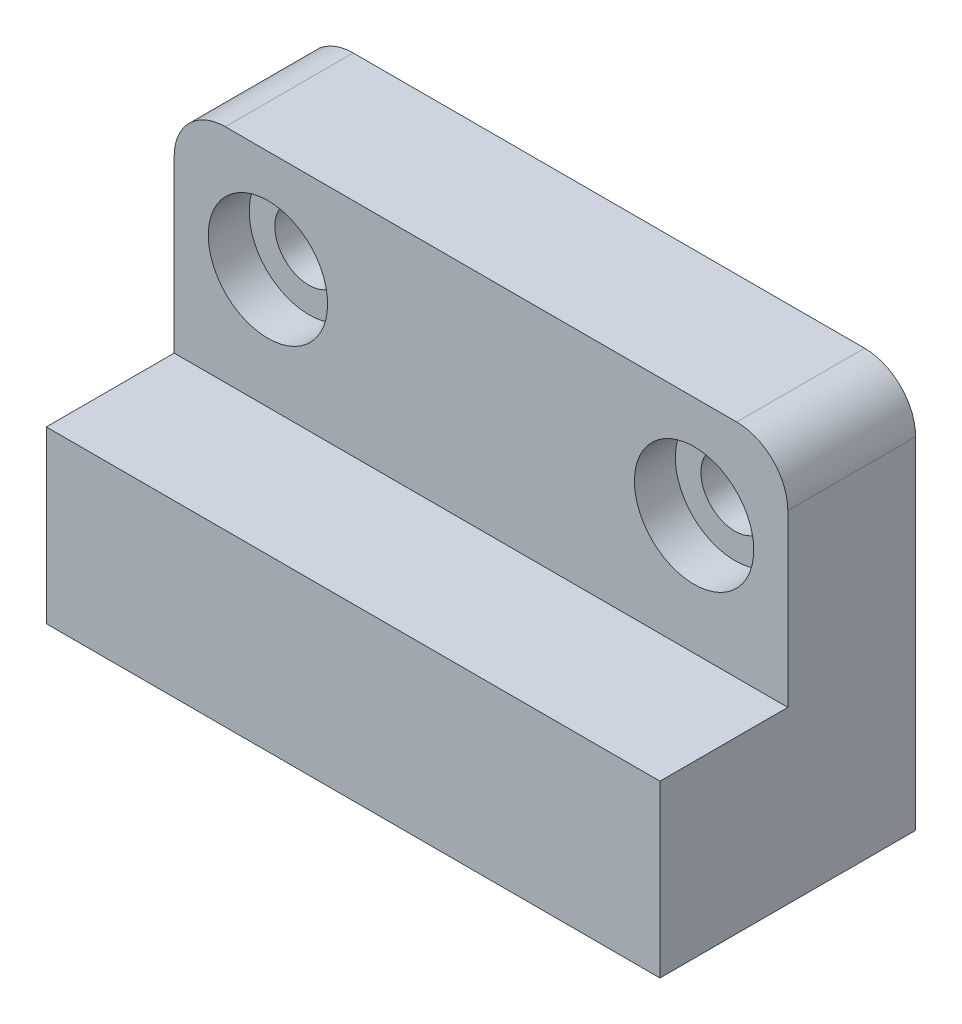
ISO-10303-21;
HEADER;
FILE_DESCRIPTION(('STEP AP214'),'2;1');
FILE_NAME('part.step','',(''),(''),'','','');
FILE_SCHEMA(('AUTOMOTIVE_DESIGN { 1 0 10303 214 1 1 1 1 }'));
ENDSEC;
DATA;
#1=APPLICATION_CONTEXT('core data for automotive mechanical design processes');
#2=APPLICATION_PROTOCOL_DEFINITION('international standard','automotive_design',2000,#1);
#3=PRODUCT_CONTEXT('',#1,'mechanical');
#4=PRODUCT('Part','Part','',(#3));
#5=PRODUCT_RELATED_PRODUCT_CATEGORY('part','',(#4));
#6=PRODUCT_DEFINITION_FORMATION('','',#4);
#7=PRODUCT_DEFINITION_CONTEXT('part definition',#1,'design');
#8=PRODUCT_DEFINITION('design','',#6,#7);
#9=PRODUCT_DEFINITION_SHAPE('','',#8);
#10=(LENGTH_UNIT() NAMED_UNIT(*) SI_UNIT(.MILLI.,.METRE.));
#11=(NAMED_UNIT(*) PLANE_ANGLE_UNIT() SI_UNIT($,.RADIAN.));
#12=(NAMED_UNIT(*) SI_UNIT($,.STERADIAN.) SOLID_ANGLE_UNIT());
#13=UNCERTAINTY_MEASURE_WITH_UNIT(LENGTH_MEASURE(1.E-05),#10,'distance_accuracy_value','');
#14=(GEOMETRIC_REPRESENTATION_CONTEXT(3) GLOBAL_UNCERTAINTY_ASSIGNED_CONTEXT((#13)) GLOBAL_UNIT_ASSIGNED_CONTEXT((#10,
#11,#12)) REPRESENTATION_CONTEXT('',''));
#15=CARTESIAN_POINT('',(0.,0.,0.));
#16=DIRECTION('',(0.,0.,1.));
#17=DIRECTION('',(1.,0.,0.));
#18=AXIS2_PLACEMENT_3D('',#15,#16,#17);
#19=CARTESIAN_POINT('',(18.,0.,7.5));
#20=DIRECTION('',(1.,0.,0.));
#21=DIRECTION('',(0.,1.,0.));
#22=AXIS2_PLACEMENT_3D('',#19,#20,#21);
#23=PLANE('',#22);
#24=DIRECTION('',(0.,-1.,0.));
#25=VECTOR('',#24,1.);
#26=CARTESIAN_POINT('',(18.,0.,0.));
#27=LINE('',#26,#25);
#28=CARTESIAN_POINT('',(18.,39.,0.));
#29=VERTEX_POINT('',#28);
#30=CARTESIAN_POINT('',(18.,19.,0.));
#31=VERTEX_POINT('',#30);
#32=EDGE_CURVE('E202',#29,#31,#27,.T.);
#33=ORIENTED_EDGE('',*,*,#32,.F.);
#34=DIRECTION('',(0.,0.,-1.));
#35=VECTOR('',#34,1.);
#36=CARTESIAN_POINT('',(18.,39.,7.5));
#37=LINE('',#36,#35);
#38=CARTESIAN_POINT('',(18.,39.,7.5));
#39=VERTEX_POINT('',#38);
#40=EDGE_CURVE('E11',#39,#29,#37,.T.);
#41=ORIENTED_EDGE('',*,*,#40,.F.);
#42=DIRECTION('',(0.,-1.,0.));
#43=VECTOR('',#42,1.);
#44=CARTESIAN_POINT('',(18.,0.,7.5));
#45=LINE('',#44,#43);
#46=CARTESIAN_POINT('',(18.,29.,7.5));
#47=VERTEX_POINT('',#46);
#48=EDGE_CURVE('E185',#39,#47,#45,.T.);
#49=ORIENTED_EDGE('',*,*,#48,.T.);
#50=DIRECTION('',(0.,0.,-1.));
#51=VECTOR('',#50,1.);
#52=CARTESIAN_POINT('',(18.,29.,15.));
#53=LINE('',#52,#51);
#54=CARTESIAN_POINT('',(18.,29.,15.));
#55=VERTEX_POINT('',#54);
#56=EDGE_CURVE('E156',#55,#47,#53,.T.);
#57=ORIENTED_EDGE('',*,*,#56,.F.);
#58=DIRECTION('',(0.,1.,0.));
#59=VECTOR('',#58,1.);
#60=CARTESIAN_POINT('',(18.,19.,15.));
#61=LINE('',#60,#59);
#62=CARTESIAN_POINT('',(18.,19.,15.));
#63=VERTEX_POINT('',#62);
#64=EDGE_CURVE('E138',#63,#55,#61,.T.);
#65=ORIENTED_EDGE('',*,*,#64,.F.);
#66=DIRECTION('',(0.,0.,-1.));
#67=VECTOR('',#66,1.);
#68=CARTESIAN_POINT('',(18.,19.,7.5));
#69=LINE('',#68,#67);
#70=EDGE_CURVE('E100',#63,#31,#69,.T.);
#71=ORIENTED_EDGE('',*,*,#70,.T.);
#72=EDGE_LOOP('',(#33,#41,#49,#57,#65,#71));
#73=FACE_BOUND('',#72,.T.);
#74=ADVANCED_FACE('F47',(#73),#23,.T.);
#75=CARTESIAN_POINT('',(15.,39.,7.5));
#76=DIRECTION('',(0.,0.,-1.));
#77=DIRECTION('',(-1.,0.,0.));
#78=AXIS2_PLACEMENT_3D('',#75,#76,#77);
#79=CYLINDRICAL_SURFACE('',#78,3.);
#80=CARTESIAN_POINT('',(15.,39.,0.));
#81=DIRECTION('',(0.,0.,1.));
#82=DIRECTION('',(1.,0.,0.));
#83=AXIS2_PLACEMENT_3D('',#80,#81,#82);
#84=CIRCLE('',#83,3.);
#85=CARTESIAN_POINT('',(15.,42.,0.));
#86=VERTEX_POINT('',#85);
#87=EDGE_CURVE('E206',#29,#86,#84,.T.);
#88=ORIENTED_EDGE('',*,*,#87,.T.);
#89=DIRECTION('',(0.,0.,-1.));
#90=VECTOR('',#89,1.);
#91=CARTESIAN_POINT('',(15.,42.,7.5));
#92=LINE('',#91,#90);
#93=CARTESIAN_POINT('',(15.,42.,7.5));
#94=VERTEX_POINT('',#93);
#95=EDGE_CURVE('E56',#94,#86,#92,.T.);
#96=ORIENTED_EDGE('',*,*,#95,.F.);
#97=CARTESIAN_POINT('',(15.,39.,7.5));
#98=DIRECTION('',(0.,0.,1.));
#99=DIRECTION('',(1.,0.,0.));
#100=AXIS2_PLACEMENT_3D('',#97,#98,#99);
#101=CIRCLE('',#100,3.);
#102=EDGE_CURVE('E188',#39,#94,#101,.T.);
#103=ORIENTED_EDGE('',*,*,#102,.F.);
#104=ORIENTED_EDGE('',*,*,#40,.T.);
#105=EDGE_LOOP('',(#88,#96,#103,#104));
#106=FACE_BOUND('',#105,.T.);
#107=ADVANCED_FACE('F254',(#106),#79,.T.);
#108=CARTESIAN_POINT('',(0.,42.,7.5));
#109=DIRECTION('',(0.,1.,0.));
#110=DIRECTION('',(0.,0.,1.));
#111=AXIS2_PLACEMENT_3D('',#108,#109,#110);
#112=PLANE('',#111);
#113=DIRECTION('',(1.,0.,0.));
#114=VECTOR('',#113,1.);
#115=CARTESIAN_POINT('',(0.,42.,0.));
#116=LINE('',#115,#114);
#117=CARTESIAN_POINT('',(-15.,42.,0.));
#118=VERTEX_POINT('',#117);
#119=EDGE_CURVE('E210',#118,#86,#116,.T.);
#120=ORIENTED_EDGE('',*,*,#119,.F.);
#121=DIRECTION('',(0.,0.,-1.));
#122=VECTOR('',#121,1.);
#123=CARTESIAN_POINT('',(-15.,42.,7.5));
#124=LINE('',#123,#122);
#125=CARTESIAN_POINT('',(-15.,42.,7.5));
#126=VERTEX_POINT('',#125);
#127=EDGE_CURVE('E226',#126,#118,#124,.T.);
#128=ORIENTED_EDGE('',*,*,#127,.F.);
#129=DIRECTION('',(1.,0.,0.));
#130=VECTOR('',#129,1.);
#131=CARTESIAN_POINT('',(0.,42.,7.5));
#132=LINE('',#131,#130);
#133=EDGE_CURVE('E192',#126,#94,#132,.T.);
#134=ORIENTED_EDGE('',*,*,#133,.T.);
#135=ORIENTED_EDGE('',*,*,#95,.T.);
#136=EDGE_LOOP('',(#120,#128,#134,#135));
#137=FACE_BOUND('',#136,.T.);
#138=ADVANCED_FACE('F260',(#137),#112,.T.);
#139=CARTESIAN_POINT('',(-15.,39.,7.5));
#140=DIRECTION('',(0.,0.,-1.));
#141=DIRECTION('',(-1.,0.,0.));
#142=AXIS2_PLACEMENT_3D('',#139,#140,#141);
#143=CYLINDRICAL_SURFACE('',#142,3.);
#144=CARTESIAN_POINT('',(-15.,39.,0.));
#145=DIRECTION('',(0.,0.,1.));
#146=DIRECTION('',(1.,0.,0.));
#147=AXIS2_PLACEMENT_3D('',#144,#145,#146);
#148=CIRCLE('',#147,3.);
#149=CARTESIAN_POINT('',(-18.,39.,0.));
#150=VERTEX_POINT('',#149);
#151=EDGE_CURVE('E214',#150,#118,#148,.F.);
#152=ORIENTED_EDGE('',*,*,#151,.F.);
#153=DIRECTION('',(0.,0.,-1.));
#154=VECTOR('',#153,1.);
#155=CARTESIAN_POINT('',(-18.,39.,7.5));
#156=LINE('',#155,#154);
#157=CARTESIAN_POINT('',(-18.,39.,7.5));
#158=VERTEX_POINT('',#157);
#159=EDGE_CURVE('E73',#158,#150,#156,.T.);
#160=ORIENTED_EDGE('',*,*,#159,.F.);
#161=CARTESIAN_POINT('',(-15.,39.,7.5));
#162=DIRECTION('',(0.,0.,1.));
#163=DIRECTION('',(1.,0.,0.));
#164=AXIS2_PLACEMENT_3D('',#161,#162,#163);
#165=CIRCLE('',#164,3.);
#166=EDGE_CURVE('E196',#158,#126,#165,.F.);
#167=ORIENTED_EDGE('',*,*,#166,.T.);
#168=ORIENTED_EDGE('',*,*,#127,.T.);
#169=EDGE_LOOP('',(#152,#160,#167,#168));
#170=FACE_BOUND('',#169,.T.);
#171=ADVANCED_FACE('F271',(#170),#143,.T.);
#172=CARTESIAN_POINT('',(-18.,0.,7.5));
#173=DIRECTION('',(1.,0.,0.));
#174=DIRECTION('',(0.,1.,0.));
#175=AXIS2_PLACEMENT_3D('',#172,#173,#174);
#176=PLANE('',#175);
#177=DIRECTION('',(0.,-1.,0.));
#178=VECTOR('',#177,1.);
#179=CARTESIAN_POINT('',(-18.,0.,0.));
#180=LINE('',#179,#178);
#181=CARTESIAN_POINT('',(-18.,19.,0.));
#182=VERTEX_POINT('',#181);
#183=EDGE_CURVE('E128',#150,#182,#180,.T.);
#184=ORIENTED_EDGE('',*,*,#183,.T.);
#185=DIRECTION('',(0.,0.,-1.));
#186=VECTOR('',#185,1.);
#187=CARTESIAN_POINT('',(-18.,19.,7.5));
#188=LINE('',#187,#186);
#189=CARTESIAN_POINT('',(-18.,19.,15.));
#190=VERTEX_POINT('',#189);
#191=EDGE_CURVE('E121',#190,#182,#188,.T.);
#192=ORIENTED_EDGE('',*,*,#191,.F.);
#193=DIRECTION('',(0.,-1.,0.));
#194=VECTOR('',#193,1.);
#195=CARTESIAN_POINT('',(-18.,19.,15.));
#196=LINE('',#195,#194);
#197=CARTESIAN_POINT('',(-18.,29.,15.));
#198=VERTEX_POINT('',#197);
#199=EDGE_CURVE('E126',#198,#190,#196,.T.);
#200=ORIENTED_EDGE('',*,*,#199,.F.);
#201=DIRECTION('',(0.,0.,-1.));
#202=VECTOR('',#201,1.);
#203=CARTESIAN_POINT('',(-18.,29.,15.));
#204=LINE('',#203,#202);
#205=CARTESIAN_POINT('',(-18.,29.,7.5));
#206=VERTEX_POINT('',#205);
#207=EDGE_CURVE('E152',#198,#206,#204,.T.);
#208=ORIENTED_EDGE('',*,*,#207,.T.);
#209=DIRECTION('',(0.,-1.,0.));
#210=VECTOR('',#209,1.);
#211=CARTESIAN_POINT('',(-18.,0.,7.5));
#212=LINE('',#211,#210);
#213=EDGE_CURVE('E199',#158,#206,#212,.T.);
#214=ORIENTED_EDGE('',*,*,#213,.F.);
#215=ORIENTED_EDGE('',*,*,#159,.T.);
#216=EDGE_LOOP('',(#184,#192,#200,#208,#214,#215));
#217=FACE_BOUND('',#216,.T.);
#218=ADVANCED_FACE('F123',(#217),#176,.F.);
#219=CARTESIAN_POINT('',(0.,19.,7.5));
#220=DIRECTION('',(0.,1.,0.));
#221=DIRECTION('',(0.,0.,1.));
#222=AXIS2_PLACEMENT_3D('',#219,#220,#221);
#223=PLANE('',#222);
#224=DIRECTION('',(1.,0.,0.));
#225=VECTOR('',#224,1.);
#226=CARTESIAN_POINT('',(0.,19.,0.));
#227=LINE('',#226,#225);
#228=EDGE_CURVE('E189',#182,#31,#227,.T.);
#229=ORIENTED_EDGE('',*,*,#228,.T.);
#230=ORIENTED_EDGE('',*,*,#70,.F.);
#231=DIRECTION('',(1.,0.,0.));
#232=VECTOR('',#231,1.);
#233=CARTESIAN_POINT('',(-18.,19.,15.));
#234=LINE('',#233,#232);
#235=EDGE_CURVE('E134',#190,#63,#234,.T.);
#236=ORIENTED_EDGE('',*,*,#235,.F.);
#237=ORIENTED_EDGE('',*,*,#191,.T.);
#238=EDGE_LOOP('',(#229,#230,#236,#237));
#239=FACE_BOUND('',#238,.T.);
#240=ADVANCED_FACE('F135',(#239),#223,.F.);
#241=CARTESIAN_POINT('',(0.,0.,7.5));
#242=DIRECTION('',(0.,0.,1.));
#243=DIRECTION('',(1.,0.,0.));
#244=AXIS2_PLACEMENT_3D('',#241,#242,#243);
#245=PLANE('',#244);
#246=DIRECTION('',(-1.,0.,0.));
#247=VECTOR('',#246,1.);
#248=CARTESIAN_POINT('',(-18.,29.,7.5));
#249=LINE('',#248,#247);
#250=EDGE_CURVE('E64',#47,#206,#249,.T.);
#251=ORIENTED_EDGE('',*,*,#250,.F.);
#252=ORIENTED_EDGE('',*,*,#48,.F.);
#253=ORIENTED_EDGE('',*,*,#102,.T.);
#254=ORIENTED_EDGE('',*,*,#133,.F.);
#255=ORIENTED_EDGE('',*,*,#166,.F.);
#256=ORIENTED_EDGE('',*,*,#213,.T.);
#257=EDGE_LOOP('',(#251,#252,#253,#254,#255,#256));
#258=FACE_BOUND('',#257,.T.);
#259=CARTESIAN_POINT('',(-12.5,36.,7.5));
#260=DIRECTION('',(0.,0.,1.));
#261=DIRECTION('',(1.,0.,0.));
#262=AXIS2_PLACEMENT_3D('',#259,#260,#261);
#263=CIRCLE('',#262,3.5);
#264=CARTESIAN_POINT('',(-9.,36.,7.5));
#265=VERTEX_POINT('',#264);
#266=EDGE_CURVE('E160',#265,#265,#263,.T.);
#267=ORIENTED_EDGE('',*,*,#266,.F.);
#268=EDGE_LOOP('',(#267));
#269=FACE_BOUND('',#268,.T.);
#270=CARTESIAN_POINT('',(12.5,36.,7.5));
#271=DIRECTION('',(0.,0.,1.));
#272=DIRECTION('',(1.,0.,0.));
#273=AXIS2_PLACEMENT_3D('',#270,#271,#272);
#274=CIRCLE('',#273,3.5);
#275=CARTESIAN_POINT('',(16.,36.,7.5));
#276=VERTEX_POINT('',#275);
#277=EDGE_CURVE('E172',#276,#276,#274,.T.);
#278=ORIENTED_EDGE('',*,*,#277,.F.);
#279=EDGE_LOOP('',(#278));
#280=FACE_BOUND('',#279,.T.);
#281=ADVANCED_FACE('F249',(#258,#269,#280),#245,.T.);
#282=CARTESIAN_POINT('',(0.,0.,0.));
#283=DIRECTION('',(0.,0.,1.));
#284=DIRECTION('',(1.,0.,0.));
#285=AXIS2_PLACEMENT_3D('',#282,#283,#284);
#286=PLANE('',#285);
#287=CARTESIAN_POINT('',(-12.5,36.,0.));
#288=DIRECTION('',(0.,0.,1.));
#289=DIRECTION('',(1.,0.,0.));
#290=AXIS2_PLACEMENT_3D('',#287,#288,#289);
#291=CIRCLE('',#290,1.99999999999999);
#292=CARTESIAN_POINT('',(-10.5,36.,0.));
#293=VERTEX_POINT('',#292);
#294=EDGE_CURVE('E50',#293,#293,#291,.T.);
#295=ORIENTED_EDGE('',*,*,#294,.T.);
#296=EDGE_LOOP('',(#295));
#297=FACE_BOUND('',#296,.T.);
#298=CARTESIAN_POINT('',(12.5,36.,0.));
#299=DIRECTION('',(0.,0.,1.));
#300=DIRECTION('',(1.,0.,0.));
#301=AXIS2_PLACEMENT_3D('',#298,#299,#300);
#302=CIRCLE('',#301,1.99999999999999);
#303=CARTESIAN_POINT('',(14.5,36.,0.));
#304=VERTEX_POINT('',#303);
#305=EDGE_CURVE('E184',#304,#304,#302,.T.);
#306=ORIENTED_EDGE('',*,*,#305,.T.);
#307=EDGE_LOOP('',(#306));
#308=FACE_BOUND('',#307,.T.);
#309=ORIENTED_EDGE('',*,*,#32,.T.);
#310=ORIENTED_EDGE('',*,*,#228,.F.);
#311=ORIENTED_EDGE('',*,*,#183,.F.);
#312=ORIENTED_EDGE('',*,*,#151,.T.);
#313=ORIENTED_EDGE('',*,*,#119,.T.);
#314=ORIENTED_EDGE('',*,*,#87,.F.);
#315=EDGE_LOOP('',(#309,#310,#311,#312,#313,#314));
#316=FACE_BOUND('',#315,.T.);
#317=ADVANCED_FACE('F234',(#297,#308,#316),#286,.F.);
#318=CARTESIAN_POINT('',(12.5,36.,7.5));
#319=DIRECTION('',(0.,0.,1.));
#320=DIRECTION('',(1.,0.,0.));
#321=AXIS2_PLACEMENT_3D('',#318,#319,#320);
#322=CYLINDRICAL_SURFACE('',#321,1.99999999999999);
#323=CARTESIAN_POINT('',(12.5,36.,5.1));
#324=DIRECTION('',(0.,0.,1.));
#325=DIRECTION('',(1.,0.,0.));
#326=AXIS2_PLACEMENT_3D('',#323,#324,#325);
#327=CIRCLE('',#326,1.99999999999999);
#328=CARTESIAN_POINT('',(14.5,36.,5.1));
#329=VERTEX_POINT('',#328);
#330=EDGE_CURVE('E180',#329,#329,#327,.T.);
#331=ORIENTED_EDGE('',*,*,#330,.T.);
#332=EDGE_LOOP('',(#331));
#333=FACE_BOUND('',#332,.T.);
#334=ORIENTED_EDGE('',*,*,#305,.F.);
#335=EDGE_LOOP('',(#334));
#336=FACE_BOUND('',#335,.T.);
#337=ADVANCED_FACE('F237',(#333,#336),#322,.F.);
#338=CARTESIAN_POINT('',(14.5,36.,5.1));
#339=DIRECTION('',(0.,0.,-1.));
#340=DIRECTION('',(-1.,0.,0.));
#341=AXIS2_PLACEMENT_3D('',#338,#339,#340);
#342=PLANE('',#341);
#343=ORIENTED_EDGE('',*,*,#330,.F.);
#344=EDGE_LOOP('',(#343));
#345=FACE_BOUND('',#344,.T.);
#346=CARTESIAN_POINT('',(12.5,36.,5.1));
#347=DIRECTION('',(0.,0.,1.));
#348=DIRECTION('',(1.,0.,0.));
#349=AXIS2_PLACEMENT_3D('',#346,#347,#348);
#350=CIRCLE('',#349,3.5);
#351=CARTESIAN_POINT('',(16.,36.,5.1));
#352=VERTEX_POINT('',#351);
#353=EDGE_CURVE('E176',#352,#352,#350,.T.);
#354=ORIENTED_EDGE('',*,*,#353,.T.);
#355=EDGE_LOOP('',(#354));
#356=FACE_BOUND('',#355,.T.);
#357=ADVANCED_FACE('F239',(#345,#356),#342,.F.);
#358=CARTESIAN_POINT('',(12.5,36.,7.5));
#359=DIRECTION('',(0.,0.,1.));
#360=DIRECTION('',(1.,0.,0.));
#361=AXIS2_PLACEMENT_3D('',#358,#359,#360);
#362=CYLINDRICAL_SURFACE('',#361,3.5);
#363=ORIENTED_EDGE('',*,*,#353,.F.);
#364=EDGE_LOOP('',(#363));
#365=FACE_BOUND('',#364,.T.);
#366=ORIENTED_EDGE('',*,*,#277,.T.);
#367=EDGE_LOOP('',(#366));
#368=FACE_BOUND('',#367,.T.);
#369=ADVANCED_FACE('F246',(#365,#368),#362,.F.);
#370=CARTESIAN_POINT('',(-12.5,36.,7.5));
#371=DIRECTION('',(0.,0.,1.));
#372=DIRECTION('',(1.,0.,0.));
#373=AXIS2_PLACEMENT_3D('',#370,#371,#372);
#374=CYLINDRICAL_SURFACE('',#373,1.99999999999999);
#375=CARTESIAN_POINT('',(-12.5,36.,5.1));
#376=DIRECTION('',(0.,0.,1.));
#377=DIRECTION('',(1.,0.,0.));
#378=AXIS2_PLACEMENT_3D('',#375,#376,#377);
#379=CIRCLE('',#378,1.99999999999999);
#380=CARTESIAN_POINT('',(-10.5,36.,5.1));
#381=VERTEX_POINT('',#380);
#382=EDGE_CURVE('E168',#381,#381,#379,.T.);
#383=ORIENTED_EDGE('',*,*,#382,.T.);
#384=EDGE_LOOP('',(#383));
#385=FACE_BOUND('',#384,.T.);
#386=ORIENTED_EDGE('',*,*,#294,.F.);
#387=EDGE_LOOP('',(#386));
#388=FACE_BOUND('',#387,.T.);
#389=ADVANCED_FACE('F322',(#385,#388),#374,.F.);
#390=CARTESIAN_POINT('',(-10.5,36.,5.1));
#391=DIRECTION('',(0.,0.,-1.));
#392=DIRECTION('',(-1.,0.,0.));
#393=AXIS2_PLACEMENT_3D('',#390,#391,#392);
#394=PLANE('',#393);
#395=ORIENTED_EDGE('',*,*,#382,.F.);
#396=EDGE_LOOP('',(#395));
#397=FACE_BOUND('',#396,.T.);
#398=CARTESIAN_POINT('',(-12.5,36.,5.1));
#399=DIRECTION('',(0.,0.,1.));
#400=DIRECTION('',(1.,0.,0.));
#401=AXIS2_PLACEMENT_3D('',#398,#399,#400);
#402=CIRCLE('',#401,3.5);
#403=CARTESIAN_POINT('',(-9.,36.,5.1));
#404=VERTEX_POINT('',#403);
#405=EDGE_CURVE('E164',#404,#404,#402,.T.);
#406=ORIENTED_EDGE('',*,*,#405,.T.);
#407=EDGE_LOOP('',(#406));
#408=FACE_BOUND('',#407,.T.);
#409=ADVANCED_FACE('F313',(#397,#408),#394,.F.);
#410=CARTESIAN_POINT('',(-12.5,36.,7.5));
#411=DIRECTION('',(0.,0.,1.));
#412=DIRECTION('',(1.,0.,0.));
#413=AXIS2_PLACEMENT_3D('',#410,#411,#412);
#414=CYLINDRICAL_SURFACE('',#413,3.5);
#415=ORIENTED_EDGE('',*,*,#405,.F.);
#416=EDGE_LOOP('',(#415));
#417=FACE_BOUND('',#416,.T.);
#418=ORIENTED_EDGE('',*,*,#266,.T.);
#419=EDGE_LOOP('',(#418));
#420=FACE_BOUND('',#419,.T.);
#421=ADVANCED_FACE('F296',(#417,#420),#414,.F.);
#422=CARTESIAN_POINT('',(-18.,29.,15.));
#423=DIRECTION('',(0.,-1.,0.));
#424=DIRECTION('',(0.,0.,-1.));
#425=AXIS2_PLACEMENT_3D('',#422,#423,#424);
#426=PLANE('',#425);
#427=ORIENTED_EDGE('',*,*,#250,.T.);
#428=ORIENTED_EDGE('',*,*,#207,.F.);
#429=DIRECTION('',(-1.,0.,0.));
#430=VECTOR('',#429,1.);
#431=CARTESIAN_POINT('',(-18.,29.,15.));
#432=LINE('',#431,#430);
#433=EDGE_CURVE('E142',#55,#198,#432,.T.);
#434=ORIENTED_EDGE('',*,*,#433,.F.);
#435=ORIENTED_EDGE('',*,*,#56,.T.);
#436=EDGE_LOOP('',(#427,#428,#434,#435));
#437=FACE_BOUND('',#436,.T.);
#438=ADVANCED_FACE('F269',(#437),#426,.F.);
#439=CARTESIAN_POINT('',(0.,0.,15.));
#440=DIRECTION('',(0.,0.,-1.));
#441=DIRECTION('',(-1.,0.,0.));
#442=AXIS2_PLACEMENT_3D('',#439,#440,#441);
#443=PLANE('',#442);
#444=ORIENTED_EDGE('',*,*,#199,.T.);
#445=ORIENTED_EDGE('',*,*,#235,.T.);
#446=ORIENTED_EDGE('',*,*,#64,.T.);
#447=ORIENTED_EDGE('',*,*,#433,.T.);
#448=EDGE_LOOP('',(#444,#445,#446,#447));
#449=FACE_BOUND('',#448,.T.);
#450=ADVANCED_FACE('F140',(#449),#443,.F.);
#451=CLOSED_SHELL('',(#74,#107,#138,#171,#218,#240,#281,#317,#337,#357,#369,#389,#409,#421,#438,#450));
#452=MANIFOLD_SOLID_BREP('B2',#451);
#453=ADVANCED_BREP_SHAPE_REPRESENTATION('',(#18,#452),#14);
#454=SHAPE_DEFINITION_REPRESENTATION(#9,#453);
ENDSEC;
END-ISO-10303-21;
